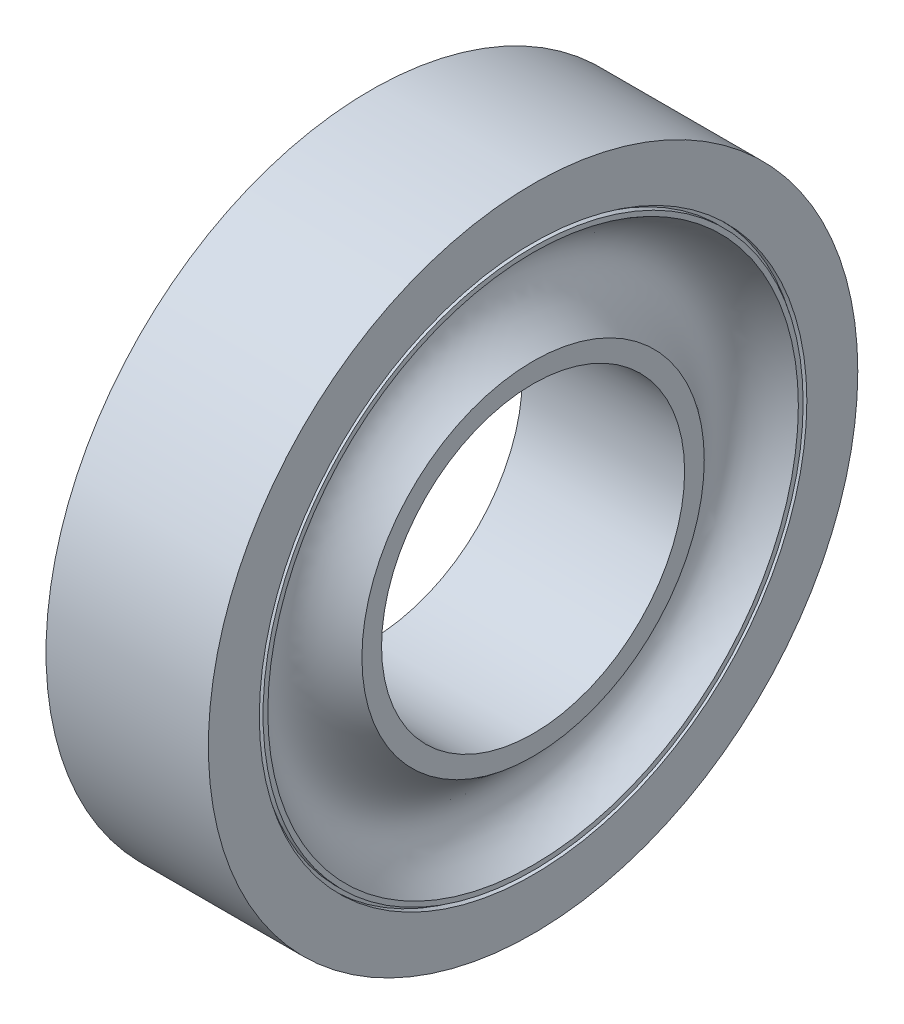
ISO-10303-21;
HEADER;
FILE_DESCRIPTION(('STEP AP214'),'2;1');
FILE_NAME('part.step','',(''),(''),'','','');
FILE_SCHEMA(('AUTOMOTIVE_DESIGN { 1 0 10303 214 1 1 1 1 }'));
ENDSEC;
DATA;
#1=APPLICATION_CONTEXT('core data for automotive mechanical design processes');
#2=APPLICATION_PROTOCOL_DEFINITION('international standard','automotive_design',2000,#1);
#3=PRODUCT_CONTEXT('',#1,'mechanical');
#4=PRODUCT('Part','Part','',(#3));
#5=PRODUCT_RELATED_PRODUCT_CATEGORY('part','',(#4));
#6=PRODUCT_DEFINITION_FORMATION('','',#4);
#7=PRODUCT_DEFINITION_CONTEXT('part definition',#1,'design');
#8=PRODUCT_DEFINITION('design','',#6,#7);
#9=PRODUCT_DEFINITION_SHAPE('','',#8);
#10=(LENGTH_UNIT() NAMED_UNIT(*) SI_UNIT(.MILLI.,.METRE.));
#11=(NAMED_UNIT(*) PLANE_ANGLE_UNIT() SI_UNIT($,.RADIAN.));
#12=(NAMED_UNIT(*) SI_UNIT($,.STERADIAN.) SOLID_ANGLE_UNIT());
#13=UNCERTAINTY_MEASURE_WITH_UNIT(LENGTH_MEASURE(1.E-05),#10,'distance_accuracy_value','');
#14=(GEOMETRIC_REPRESENTATION_CONTEXT(3) GLOBAL_UNCERTAINTY_ASSIGNED_CONTEXT((#13)) GLOBAL_UNIT_ASSIGNED_CONTEXT((#10,
#11,#12)) REPRESENTATION_CONTEXT('',''));
#15=CARTESIAN_POINT('',(0.,0.,0.));
#16=DIRECTION('',(0.,0.,1.));
#17=DIRECTION('',(1.,0.,0.));
#18=AXIS2_PLACEMENT_3D('',#15,#16,#17);
#19=CARTESIAN_POINT('',(-7.5,14.,0.));
#20=DIRECTION('',(-1.,0.,0.));
#21=DIRECTION('',(0.,0.,1.));
#22=AXIS2_PLACEMENT_3D('',#19,#20,#21);
#23=PLANE('',#22);
#24=CARTESIAN_POINT('',(-7.49999999999999,0.,0.));
#25=DIRECTION('',(1.,0.,0.));
#26=DIRECTION('',(0.,0.,-1.));
#27=AXIS2_PLACEMENT_3D('',#24,#25,#26);
#28=CIRCLE('',#27,14.);
#29=CARTESIAN_POINT('',(-7.49999999999999,0.,-14.));
#30=VERTEX_POINT('',#29);
#31=EDGE_CURVE('E85',#30,#30,#28,.T.);
#32=ORIENTED_EDGE('',*,*,#31,.T.);
#33=EDGE_LOOP('',(#32));
#34=FACE_BOUND('',#33,.T.);
#35=CARTESIAN_POINT('',(-7.49999999999999,0.,0.));
#36=DIRECTION('',(1.,0.,0.));
#37=DIRECTION('',(0.,0.,-1.));
#38=AXIS2_PLACEMENT_3D('',#35,#36,#37);
#39=CIRCLE('',#38,15.8150324311788);
#40=CARTESIAN_POINT('',(-7.49999999999999,0.,-15.8150324311788));
#41=VERTEX_POINT('',#40);
#42=EDGE_CURVE('E10',#41,#41,#39,.T.);
#43=ORIENTED_EDGE('',*,*,#42,.F.);
#44=EDGE_LOOP('',(#43));
#45=FACE_BOUND('',#44,.T.);
#46=ADVANCED_FACE('F33',(#34,#45),#23,.T.);
#47=CARTESIAN_POINT('',(-7.5,24.5077089180318,0.));
#48=CARTESIAN_POINT('',(-0.221533758612963,20.8547837469212,0.));
#49=CARTESIAN_POINT('',(-7.5,15.8150324311788,0.));
#50=B_SPLINE_CURVE_WITH_KNOTS('',2,(#47,#48,#49),.UNSPECIFIED.,.F.,.F.,(3,3),(0.,1.),.UNSPECIFIED.);
#51=CARTESIAN_POINT('',(37.4227840582204,0.,0.));
#52=DIRECTION('',(1.,0.,0.));
#53=AXIS1_PLACEMENT('',#51,#52);
#54=SURFACE_OF_REVOLUTION('',#50,#53);
#55=ORIENTED_EDGE('',*,*,#42,.T.);
#56=EDGE_LOOP('',(#55));
#57=FACE_BOUND('',#56,.T.);
#58=CARTESIAN_POINT('',(-7.49999999999999,0.,0.));
#59=DIRECTION('',(1.,0.,0.));
#60=DIRECTION('',(0.,0.,-1.));
#61=AXIS2_PLACEMENT_3D('',#58,#59,#60);
#62=CIRCLE('',#61,24.5077089180318);
#63=CARTESIAN_POINT('',(-7.49999999999999,0.,-24.5077089180318));
#64=VERTEX_POINT('',#63);
#65=EDGE_CURVE('E39',#64,#64,#62,.T.);
#66=ORIENTED_EDGE('',*,*,#65,.F.);
#67=EDGE_LOOP('',(#66));
#68=FACE_BOUND('',#67,.T.);
#69=ADVANCED_FACE('F98',(#57,#68),#54,.F.);
#70=CARTESIAN_POINT('',(-7.5,24.5077089180318,0.));
#71=DIRECTION('',(-1.,0.,0.));
#72=DIRECTION('',(0.,0.,1.));
#73=AXIS2_PLACEMENT_3D('',#70,#71,#72);
#74=PLANE('',#73);
#75=ORIENTED_EDGE('',*,*,#65,.T.);
#76=EDGE_LOOP('',(#75));
#77=FACE_BOUND('',#76,.T.);
#78=CARTESIAN_POINT('',(-7.49999999999999,0.,0.));
#79=DIRECTION('',(1.,0.,0.));
#80=DIRECTION('',(0.,0.,-1.));
#81=AXIS2_PLACEMENT_3D('',#78,#79,#80);
#82=CIRCLE('',#81,24.9502716062252);
#83=CARTESIAN_POINT('',(-7.49999999999999,0.,-24.9502716062252));
#84=VERTEX_POINT('',#83);
#85=EDGE_CURVE('E43',#84,#84,#82,.T.);
#86=ORIENTED_EDGE('',*,*,#85,.F.);
#87=EDGE_LOOP('',(#86));
#88=FACE_BOUND('',#87,.T.);
#89=ADVANCED_FACE('F101',(#77,#88),#74,.T.);
#90=CARTESIAN_POINT('',(37.4227840582204,0.,0.));
#91=DIRECTION('',(1.,0.,0.));
#92=DIRECTION('',(0.,0.,-1.));
#93=AXIS2_PLACEMENT_3D('',#90,#91,#92);
#94=CYLINDRICAL_SURFACE('',#93,24.9502716062252);
#95=ORIENTED_EDGE('',*,*,#85,.T.);
#96=EDGE_LOOP('',(#95));
#97=FACE_BOUND('',#96,.T.);
#98=CARTESIAN_POINT('',(-6.95807618193402,0.,0.));
#99=DIRECTION('',(1.,0.,0.));
#100=DIRECTION('',(0.,0.,-1.));
#101=AXIS2_PLACEMENT_3D('',#98,#99,#100);
#102=CIRCLE('',#101,24.9502716062252);
#103=CARTESIAN_POINT('',(-6.95807618193402,0.,-24.9502716062252));
#104=VERTEX_POINT('',#103);
#105=EDGE_CURVE('E47',#104,#104,#102,.T.);
#106=ORIENTED_EDGE('',*,*,#105,.F.);
#107=EDGE_LOOP('',(#106));
#108=FACE_BOUND('',#107,.T.);
#109=ADVANCED_FACE('F104',(#97,#108),#94,.T.);
#110=CARTESIAN_POINT('',(-6.95807618193403,24.9502716062252,0.));
#111=DIRECTION('',(-1.,0.,0.));
#112=DIRECTION('',(0.,0.,1.));
#113=AXIS2_PLACEMENT_3D('',#110,#111,#112);
#114=PLANE('',#113);
#115=ORIENTED_EDGE('',*,*,#105,.T.);
#116=EDGE_LOOP('',(#115));
#117=FACE_BOUND('',#116,.T.);
#118=CARTESIAN_POINT('',(-6.95807618193402,0.,0.));
#119=DIRECTION('',(1.,0.,0.));
#120=DIRECTION('',(0.,0.,-1.));
#121=AXIS2_PLACEMENT_3D('',#118,#119,#120);
#122=CIRCLE('',#121,25.2929007841813);
#123=CARTESIAN_POINT('',(-6.95807618193402,0.,-25.2929007841813));
#124=VERTEX_POINT('',#123);
#125=EDGE_CURVE('E52',#124,#124,#122,.T.);
#126=ORIENTED_EDGE('',*,*,#125,.F.);
#127=EDGE_LOOP('',(#126));
#128=FACE_BOUND('',#127,.T.);
#129=ADVANCED_FACE('F107',(#117,#128),#114,.T.);
#130=CARTESIAN_POINT('',(37.4227840582204,0.,0.));
#131=DIRECTION('',(1.,0.,0.));
#132=DIRECTION('',(0.,0.,-1.));
#133=AXIS2_PLACEMENT_3D('',#130,#131,#132);
#134=CYLINDRICAL_SURFACE('',#133,25.2929007841813);
#135=ORIENTED_EDGE('',*,*,#125,.T.);
#136=EDGE_LOOP('',(#135));
#137=FACE_BOUND('',#136,.T.);
#138=CARTESIAN_POINT('',(-7.49999999999999,0.,0.));
#139=DIRECTION('',(1.,0.,0.));
#140=DIRECTION('',(0.,0.,-1.));
#141=AXIS2_PLACEMENT_3D('',#138,#139,#140);
#142=CIRCLE('',#141,25.2929007841813);
#143=CARTESIAN_POINT('',(-7.49999999999999,0.,-25.2929007841813));
#144=VERTEX_POINT('',#143);
#145=EDGE_CURVE('E55',#144,#144,#142,.T.);
#146=ORIENTED_EDGE('',*,*,#145,.F.);
#147=EDGE_LOOP('',(#146));
#148=FACE_BOUND('',#147,.T.);
#149=ADVANCED_FACE('F111',(#137,#148),#134,.F.);
#150=CARTESIAN_POINT('',(-7.5,25.2929007841813,0.));
#151=DIRECTION('',(-1.,0.,0.));
#152=DIRECTION('',(0.,0.,1.));
#153=AXIS2_PLACEMENT_3D('',#150,#151,#152);
#154=PLANE('',#153);
#155=ORIENTED_EDGE('',*,*,#145,.T.);
#156=EDGE_LOOP('',(#155));
#157=FACE_BOUND('',#156,.T.);
#158=CARTESIAN_POINT('',(-7.49999999999999,0.,0.));
#159=DIRECTION('',(1.,0.,0.));
#160=DIRECTION('',(0.,0.,-1.));
#161=AXIS2_PLACEMENT_3D('',#158,#159,#160);
#162=CIRCLE('',#161,30.);
#163=CARTESIAN_POINT('',(-7.49999999999999,0.,-30.));
#164=VERTEX_POINT('',#163);
#165=EDGE_CURVE('E58',#164,#164,#162,.T.);
#166=ORIENTED_EDGE('',*,*,#165,.F.);
#167=EDGE_LOOP('',(#166));
#168=FACE_BOUND('',#167,.T.);
#169=ADVANCED_FACE('F115',(#157,#168),#154,.T.);
#170=CARTESIAN_POINT('',(37.4227840582204,0.,0.));
#171=DIRECTION('',(1.,0.,0.));
#172=DIRECTION('',(0.,0.,-1.));
#173=AXIS2_PLACEMENT_3D('',#170,#171,#172);
#174=CYLINDRICAL_SURFACE('',#173,30.);
#175=ORIENTED_EDGE('',*,*,#165,.T.);
#176=EDGE_LOOP('',(#175));
#177=FACE_BOUND('',#176,.T.);
#178=CARTESIAN_POINT('',(7.5,0.,0.));
#179=DIRECTION('',(1.,0.,0.));
#180=DIRECTION('',(0.,0.,-1.));
#181=AXIS2_PLACEMENT_3D('',#178,#179,#180);
#182=CIRCLE('',#181,30.);
#183=CARTESIAN_POINT('',(7.5,0.,-30.));
#184=VERTEX_POINT('',#183);
#185=EDGE_CURVE('E61',#184,#184,#182,.T.);
#186=ORIENTED_EDGE('',*,*,#185,.F.);
#187=EDGE_LOOP('',(#186));
#188=FACE_BOUND('',#187,.T.);
#189=ADVANCED_FACE('F119',(#177,#188),#174,.T.);
#190=CARTESIAN_POINT('',(7.5,25.2929007841813,0.));
#191=DIRECTION('',(1.,0.,0.));
#192=DIRECTION('',(0.,0.,-1.));
#193=AXIS2_PLACEMENT_3D('',#190,#191,#192);
#194=PLANE('',#193);
#195=ORIENTED_EDGE('',*,*,#185,.T.);
#196=EDGE_LOOP('',(#195));
#197=FACE_BOUND('',#196,.T.);
#198=CARTESIAN_POINT('',(7.5,0.,0.));
#199=DIRECTION('',(1.,0.,0.));
#200=DIRECTION('',(0.,0.,-1.));
#201=AXIS2_PLACEMENT_3D('',#198,#199,#200);
#202=CIRCLE('',#201,25.2929007841813);
#203=CARTESIAN_POINT('',(7.5,0.,-25.2929007841813));
#204=VERTEX_POINT('',#203);
#205=EDGE_CURVE('E64',#204,#204,#202,.T.);
#206=ORIENTED_EDGE('',*,*,#205,.F.);
#207=EDGE_LOOP('',(#206));
#208=FACE_BOUND('',#207,.T.);
#209=ADVANCED_FACE('F123',(#197,#208),#194,.T.);
#210=CARTESIAN_POINT('',(37.4227840582204,0.,0.));
#211=DIRECTION('',(1.,0.,0.));
#212=DIRECTION('',(0.,0.,-1.));
#213=AXIS2_PLACEMENT_3D('',#210,#211,#212);
#214=CYLINDRICAL_SURFACE('',#213,25.2929007841813);
#215=ORIENTED_EDGE('',*,*,#205,.T.);
#216=EDGE_LOOP('',(#215));
#217=FACE_BOUND('',#216,.T.);
#218=CARTESIAN_POINT('',(6.95807618193403,0.,0.));
#219=DIRECTION('',(1.,0.,0.));
#220=DIRECTION('',(0.,0.,-1.));
#221=AXIS2_PLACEMENT_3D('',#218,#219,#220);
#222=CIRCLE('',#221,25.2929007841813);
#223=CARTESIAN_POINT('',(6.95807618193403,0.,-25.2929007841813));
#224=VERTEX_POINT('',#223);
#225=EDGE_CURVE('E67',#224,#224,#222,.T.);
#226=ORIENTED_EDGE('',*,*,#225,.F.);
#227=EDGE_LOOP('',(#226));
#228=FACE_BOUND('',#227,.T.);
#229=ADVANCED_FACE('F127',(#217,#228),#214,.F.);
#230=CARTESIAN_POINT('',(6.95807618193403,24.9502716062252,0.));
#231=DIRECTION('',(1.,0.,0.));
#232=DIRECTION('',(0.,0.,-1.));
#233=AXIS2_PLACEMENT_3D('',#230,#231,#232);
#234=PLANE('',#233);
#235=ORIENTED_EDGE('',*,*,#225,.T.);
#236=EDGE_LOOP('',(#235));
#237=FACE_BOUND('',#236,.T.);
#238=CARTESIAN_POINT('',(6.95807618193403,0.,0.));
#239=DIRECTION('',(1.,0.,0.));
#240=DIRECTION('',(0.,0.,-1.));
#241=AXIS2_PLACEMENT_3D('',#238,#239,#240);
#242=CIRCLE('',#241,24.9502716062252);
#243=CARTESIAN_POINT('',(6.95807618193403,0.,-24.9502716062252));
#244=VERTEX_POINT('',#243);
#245=EDGE_CURVE('E70',#244,#244,#242,.T.);
#246=ORIENTED_EDGE('',*,*,#245,.F.);
#247=EDGE_LOOP('',(#246));
#248=FACE_BOUND('',#247,.T.);
#249=ADVANCED_FACE('F131',(#237,#248),#234,.T.);
#250=CARTESIAN_POINT('',(37.4227840582204,0.,0.));
#251=DIRECTION('',(1.,0.,0.));
#252=DIRECTION('',(0.,0.,-1.));
#253=AXIS2_PLACEMENT_3D('',#250,#251,#252);
#254=CYLINDRICAL_SURFACE('',#253,24.9502716062252);
#255=ORIENTED_EDGE('',*,*,#245,.T.);
#256=EDGE_LOOP('',(#255));
#257=FACE_BOUND('',#256,.T.);
#258=CARTESIAN_POINT('',(7.5,0.,0.));
#259=DIRECTION('',(1.,0.,0.));
#260=DIRECTION('',(0.,0.,-1.));
#261=AXIS2_PLACEMENT_3D('',#258,#259,#260);
#262=CIRCLE('',#261,24.9502716062252);
#263=CARTESIAN_POINT('',(7.5,0.,-24.9502716062252));
#264=VERTEX_POINT('',#263);
#265=EDGE_CURVE('E73',#264,#264,#262,.T.);
#266=ORIENTED_EDGE('',*,*,#265,.F.);
#267=EDGE_LOOP('',(#266));
#268=FACE_BOUND('',#267,.T.);
#269=ADVANCED_FACE('F135',(#257,#268),#254,.T.);
#270=CARTESIAN_POINT('',(7.5,24.5077089180318,0.));
#271=DIRECTION('',(1.,0.,0.));
#272=DIRECTION('',(0.,0.,-1.));
#273=AXIS2_PLACEMENT_3D('',#270,#271,#272);
#274=PLANE('',#273);
#275=ORIENTED_EDGE('',*,*,#265,.T.);
#276=EDGE_LOOP('',(#275));
#277=FACE_BOUND('',#276,.T.);
#278=CARTESIAN_POINT('',(7.5,0.,0.));
#279=DIRECTION('',(1.,0.,0.));
#280=DIRECTION('',(0.,0.,-1.));
#281=AXIS2_PLACEMENT_3D('',#278,#279,#280);
#282=CIRCLE('',#281,24.5077089180318);
#283=CARTESIAN_POINT('',(7.5,0.,-24.5077089180318));
#284=VERTEX_POINT('',#283);
#285=EDGE_CURVE('E76',#284,#284,#282,.T.);
#286=ORIENTED_EDGE('',*,*,#285,.F.);
#287=EDGE_LOOP('',(#286));
#288=FACE_BOUND('',#287,.T.);
#289=ADVANCED_FACE('F139',(#277,#288),#274,.T.);
#290=CARTESIAN_POINT('',(7.50000000000001,15.8150324311788,0.));
#291=CARTESIAN_POINT('',(0.221533758612973,20.8547837469212,0.));
#292=CARTESIAN_POINT('',(7.5,24.5077089180318,0.));
#293=B_SPLINE_CURVE_WITH_KNOTS('',2,(#290,#291,#292),.UNSPECIFIED.,.F.,.F.,(3,3),(0.,1.),.UNSPECIFIED.);
#294=CARTESIAN_POINT('',(37.4227840582204,0.,0.));
#295=DIRECTION('',(1.,0.,0.));
#296=AXIS1_PLACEMENT('',#294,#295);
#297=SURFACE_OF_REVOLUTION('',#293,#296);
#298=ORIENTED_EDGE('',*,*,#285,.T.);
#299=EDGE_LOOP('',(#298));
#300=FACE_BOUND('',#299,.T.);
#301=CARTESIAN_POINT('',(7.50000000000001,0.,0.));
#302=DIRECTION('',(1.,0.,0.));
#303=DIRECTION('',(0.,0.,-1.));
#304=AXIS2_PLACEMENT_3D('',#301,#302,#303);
#305=CIRCLE('',#304,15.8150324311788);
#306=CARTESIAN_POINT('',(7.50000000000001,0.,-15.8150324311788));
#307=VERTEX_POINT('',#306);
#308=EDGE_CURVE('E79',#307,#307,#305,.T.);
#309=ORIENTED_EDGE('',*,*,#308,.F.);
#310=EDGE_LOOP('',(#309));
#311=FACE_BOUND('',#310,.T.);
#312=ADVANCED_FACE('F143',(#300,#311),#297,.F.);
#313=CARTESIAN_POINT('',(7.50000000000001,14.,0.));
#314=DIRECTION('',(1.,0.,0.));
#315=DIRECTION('',(0.,0.,-1.));
#316=AXIS2_PLACEMENT_3D('',#313,#314,#315);
#317=PLANE('',#316);
#318=ORIENTED_EDGE('',*,*,#308,.T.);
#319=EDGE_LOOP('',(#318));
#320=FACE_BOUND('',#319,.T.);
#321=CARTESIAN_POINT('',(7.50000000000001,0.,0.));
#322=DIRECTION('',(1.,0.,0.));
#323=DIRECTION('',(0.,0.,-1.));
#324=AXIS2_PLACEMENT_3D('',#321,#322,#323);
#325=CIRCLE('',#324,14.);
#326=CARTESIAN_POINT('',(7.50000000000001,0.,-14.));
#327=VERTEX_POINT('',#326);
#328=EDGE_CURVE('E82',#327,#327,#325,.T.);
#329=ORIENTED_EDGE('',*,*,#328,.F.);
#330=EDGE_LOOP('',(#329));
#331=FACE_BOUND('',#330,.T.);
#332=ADVANCED_FACE('F147',(#320,#331),#317,.T.);
#333=CARTESIAN_POINT('',(37.4227840582204,0.,0.));
#334=DIRECTION('',(1.,0.,0.));
#335=DIRECTION('',(0.,0.,-1.));
#336=AXIS2_PLACEMENT_3D('',#333,#334,#335);
#337=CYLINDRICAL_SURFACE('',#336,14.);
#338=ORIENTED_EDGE('',*,*,#328,.T.);
#339=EDGE_LOOP('',(#338));
#340=FACE_BOUND('',#339,.T.);
#341=ORIENTED_EDGE('',*,*,#31,.F.);
#342=EDGE_LOOP('',(#341));
#343=FACE_BOUND('',#342,.T.);
#344=ADVANCED_FACE('F151',(#340,#343),#337,.F.);
#345=CLOSED_SHELL('',(#46,#69,#89,#109,#129,#149,#169,#189,#209,#229,#249,#269,#289,#312,#332,#344));
#346=MANIFOLD_SOLID_BREP('B2',#345);
#347=ADVANCED_BREP_SHAPE_REPRESENTATION('',(#18,#346),#14);
#348=SHAPE_DEFINITION_REPRESENTATION(#9,#347);
ENDSEC;
END-ISO-10303-21;
